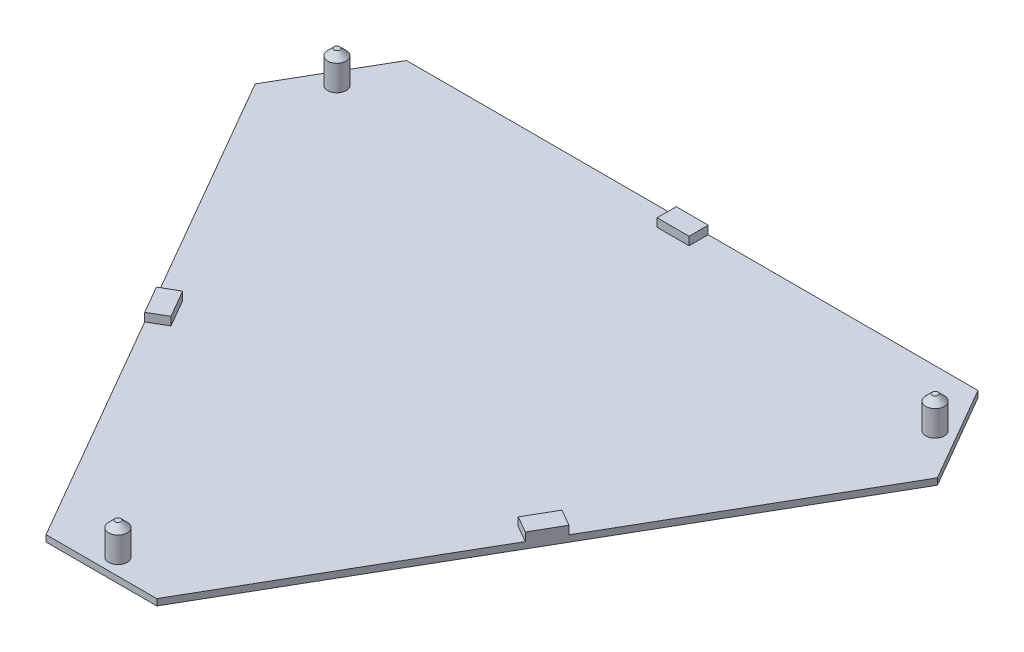
ISO-10303-21;
HEADER;
FILE_DESCRIPTION(('STEP AP214'),'2;1');
FILE_NAME('part.step','',(''),(''),'','','');
FILE_SCHEMA(('AUTOMOTIVE_DESIGN { 1 0 10303 214 1 1 1 1 }'));
ENDSEC;
DATA;
#1=APPLICATION_CONTEXT('core data for automotive mechanical design processes');
#2=APPLICATION_PROTOCOL_DEFINITION('international standard','automotive_design',2000,#1);
#3=PRODUCT_CONTEXT('',#1,'mechanical');
#4=PRODUCT('Part','Part','',(#3));
#5=PRODUCT_RELATED_PRODUCT_CATEGORY('part','',(#4));
#6=PRODUCT_DEFINITION_FORMATION('','',#4);
#7=PRODUCT_DEFINITION_CONTEXT('part definition',#1,'design');
#8=PRODUCT_DEFINITION('design','',#6,#7);
#9=PRODUCT_DEFINITION_SHAPE('','',#8);
#10=(LENGTH_UNIT() NAMED_UNIT(*) SI_UNIT(.MILLI.,.METRE.));
#11=(NAMED_UNIT(*) PLANE_ANGLE_UNIT() SI_UNIT($,.RADIAN.));
#12=(NAMED_UNIT(*) SI_UNIT($,.STERADIAN.) SOLID_ANGLE_UNIT());
#13=UNCERTAINTY_MEASURE_WITH_UNIT(LENGTH_MEASURE(1.E-05),#10,'distance_accuracy_value','');
#14=(GEOMETRIC_REPRESENTATION_CONTEXT(3) GLOBAL_UNCERTAINTY_ASSIGNED_CONTEXT((#13)) GLOBAL_UNIT_ASSIGNED_CONTEXT((#10,
#11,#12)) REPRESENTATION_CONTEXT('',''));
#15=CARTESIAN_POINT('',(0.,0.,0.));
#16=DIRECTION('',(0.,0.,1.));
#17=DIRECTION('',(1.,0.,0.));
#18=AXIS2_PLACEMENT_3D('',#15,#16,#17);
#19=CARTESIAN_POINT('',(0.,1.,0.));
#20=DIRECTION('',(0.,-1.,0.));
#21=DIRECTION('',(0.,0.,-1.));
#22=AXIS2_PLACEMENT_3D('',#19,#20,#21);
#23=PLANE('',#22);
#24=CARTESIAN_POINT('',(0.,1.,54.));
#25=DIRECTION('',(0.,-1.,0.));
#26=DIRECTION('',(0.,0.,-1.));
#27=AXIS2_PLACEMENT_3D('',#24,#25,#26);
#28=CIRCLE('',#27,1.45);
#29=CARTESIAN_POINT('',(0.,1.,52.55));
#30=VERTEX_POINT('',#29);
#31=EDGE_CURVE('E292',#30,#30,#28,.F.);
#32=ORIENTED_EDGE('',*,*,#31,.F.);
#33=EDGE_LOOP('',(#32));
#34=FACE_BOUND('',#33,.T.);
#35=CARTESIAN_POINT('',(-46.7653718043597,1.,-27.));
#36=DIRECTION('',(0.,-1.,0.));
#37=DIRECTION('',(0.,0.,-1.));
#38=AXIS2_PLACEMENT_3D('',#35,#36,#37);
#39=CIRCLE('',#38,1.45);
#40=CARTESIAN_POINT('',(-46.7653718043597,1.,-28.45));
#41=VERTEX_POINT('',#40);
#42=EDGE_CURVE('E295',#41,#41,#39,.F.);
#43=ORIENTED_EDGE('',*,*,#42,.F.);
#44=EDGE_LOOP('',(#43));
#45=FACE_BOUND('',#44,.T.);
#46=CARTESIAN_POINT('',(46.7653718043597,1.,-27.));
#47=DIRECTION('',(0.,-1.,0.));
#48=DIRECTION('',(0.,0.,-1.));
#49=AXIS2_PLACEMENT_3D('',#46,#47,#48);
#50=CIRCLE('',#49,1.45);
#51=CARTESIAN_POINT('',(46.7653718043597,1.,-28.45));
#52=VERTEX_POINT('',#51);
#53=EDGE_CURVE('E298',#52,#52,#50,.F.);
#54=ORIENTED_EDGE('',*,*,#53,.F.);
#55=EDGE_LOOP('',(#54));
#56=FACE_BOUND('',#55,.T.);
#57=DIRECTION('',(0.866025403784438,0.,-0.500000000000001));
#58=VECTOR('',#57,1.);
#59=CARTESIAN_POINT('',(1.24999999999999,1.,2.16506350946108));
#60=LINE('',#59,#58);
#61=CARTESIAN_POINT('',(-29.75,1.,20.0629218543395));
#62=VERTEX_POINT('',#61);
#63=CARTESIAN_POINT('',(-27.1519237886467,1.,18.5629218543395));
#64=VERTEX_POINT('',#63);
#65=EDGE_CURVE('E178',#62,#64,#60,.T.);
#66=ORIENTED_EDGE('',*,*,#65,.F.);
#67=DIRECTION('',(0.5,0.,0.866025403784438));
#68=VECTOR('',#67,1.);
#69=CARTESIAN_POINT('',(-53.3397459621556,1.,-20.7957166897568));
#70=LINE('',#69,#68);
#71=CARTESIAN_POINT('',(-8.6602540378444,1.,56.5914333795135));
#72=VERTEX_POINT('',#71);
#73=EDGE_CURVE('E253',#62,#72,#70,.T.);
#74=ORIENTED_EDGE('',*,*,#73,.T.);
#75=DIRECTION('',(1.,0.,0.));
#76=VECTOR('',#75,1.);
#77=CARTESIAN_POINT('',(8.66025403784441,1.,56.5914333795136));
#78=LINE('',#77,#76);
#79=CARTESIAN_POINT('',(8.66025403784441,1.,56.5914333795136));
#80=VERTEX_POINT('',#79);
#81=EDGE_CURVE('E256',#72,#80,#78,.T.);
#82=ORIENTED_EDGE('',*,*,#81,.T.);
#83=DIRECTION('',(0.5,0.,-0.866025403784439));
#84=VECTOR('',#83,1.);
#85=CARTESIAN_POINT('',(8.66025403784441,1.,56.5914333795136));
#86=LINE('',#85,#84);
#87=CARTESIAN_POINT('',(29.75,1.,20.0629218543395));
#88=VERTEX_POINT('',#87);
#89=EDGE_CURVE('E259',#80,#88,#86,.T.);
#90=ORIENTED_EDGE('',*,*,#89,.T.);
#91=DIRECTION('',(0.866025403784439,0.,0.5));
#92=VECTOR('',#91,1.);
#93=CARTESIAN_POINT('',(-1.25,1.,2.16506350946111));
#94=LINE('',#93,#92);
#95=CARTESIAN_POINT('',(27.1519237886467,1.,18.5629218543395));
#96=VERTEX_POINT('',#95);
#97=EDGE_CURVE('E208',#96,#88,#94,.T.);
#98=ORIENTED_EDGE('',*,*,#97,.F.);
#99=DIRECTION('',(-0.5,0.,0.866025403784438));
#100=VECTOR('',#99,1.);
#101=CARTESIAN_POINT('',(28.4019237886467,1.,16.3978583448784));
#102=LINE('',#101,#100);
#103=CARTESIAN_POINT('',(29.6519237886467,1.,14.2327948354173));
#104=VERTEX_POINT('',#103);
#105=EDGE_CURVE('E211',#104,#96,#102,.T.);
#106=ORIENTED_EDGE('',*,*,#105,.F.);
#107=DIRECTION('',(-0.866025403784439,0.,-0.499999999999999));
#108=VECTOR('',#107,1.);
#109=CARTESIAN_POINT('',(1.24999999999998,1.,-2.16506350946107));
#110=LINE('',#109,#108);
#111=CARTESIAN_POINT('',(32.25,1.,15.7327948354173));
#112=VERTEX_POINT('',#111);
#113=EDGE_CURVE('E214',#112,#104,#110,.T.);
#114=ORIENTED_EDGE('',*,*,#113,.F.);
#115=CARTESIAN_POINT('',(53.3397459621556,1.,-20.7957166897568));
#116=VERTEX_POINT('',#115);
#117=EDGE_CURVE('E258',#112,#116,#86,.T.);
#118=ORIENTED_EDGE('',*,*,#117,.T.);
#119=DIRECTION('',(-0.5,0.,-0.866025403784439));
#120=VECTOR('',#119,1.);
#121=CARTESIAN_POINT('',(44.6794919243112,1.,-35.7957166897568));
#122=LINE('',#121,#120);
#123=CARTESIAN_POINT('',(44.6794919243112,1.,-35.7957166897568));
#124=VERTEX_POINT('',#123);
#125=EDGE_CURVE('E261',#116,#124,#122,.T.);
#126=ORIENTED_EDGE('',*,*,#125,.T.);
#127=DIRECTION('',(-1.,0.,0.));
#128=VECTOR('',#127,1.);
#129=CARTESIAN_POINT('',(44.6794919243112,1.,-35.7957166897568));
#130=LINE('',#129,#128);
#131=CARTESIAN_POINT('',(2.5,1.,-35.7957166897568));
#132=VERTEX_POINT('',#131);
#133=EDGE_CURVE('E248',#124,#132,#130,.T.);
#134=ORIENTED_EDGE('',*,*,#133,.T.);
#135=DIRECTION('',(0.,0.,-1.));
#136=VECTOR('',#135,1.);
#137=CARTESIAN_POINT('',(2.50000000000001,1.,0.));
#138=LINE('',#137,#136);
#139=CARTESIAN_POINT('',(2.5,1.,-32.7957166897568));
#140=VERTEX_POINT('',#139);
#141=EDGE_CURVE('E238',#140,#132,#138,.T.);
#142=ORIENTED_EDGE('',*,*,#141,.F.);
#143=DIRECTION('',(1.,0.,0.));
#144=VECTOR('',#143,1.);
#145=CARTESIAN_POINT('',(0.,1.,-32.7957166897568));
#146=LINE('',#145,#144);
#147=CARTESIAN_POINT('',(-2.5,1.,-32.7957166897568));
#148=VERTEX_POINT('',#147);
#149=EDGE_CURVE('E241',#148,#140,#146,.T.);
#150=ORIENTED_EDGE('',*,*,#149,.F.);
#151=DIRECTION('',(0.,0.,1.));
#152=VECTOR('',#151,1.);
#153=CARTESIAN_POINT('',(-2.50000000000001,1.,0.));
#154=LINE('',#153,#152);
#155=CARTESIAN_POINT('',(-2.5,1.,-35.7957166897568));
#156=VERTEX_POINT('',#155);
#157=EDGE_CURVE('E244',#156,#148,#154,.T.);
#158=ORIENTED_EDGE('',*,*,#157,.F.);
#159=CARTESIAN_POINT('',(-44.6794919243112,1.,-35.7957166897568));
#160=VERTEX_POINT('',#159);
#161=EDGE_CURVE('E251',#156,#160,#130,.T.);
#162=ORIENTED_EDGE('',*,*,#161,.T.);
#163=DIRECTION('',(-0.499999999999999,0.,0.866025403784439));
#164=VECTOR('',#163,1.);
#165=CARTESIAN_POINT('',(-53.3397459621556,1.,-20.7957166897568));
#166=LINE('',#165,#164);
#167=CARTESIAN_POINT('',(-53.3397459621556,1.,-20.7957166897568));
#168=VERTEX_POINT('',#167);
#169=EDGE_CURVE('E250',#160,#168,#166,.T.);
#170=ORIENTED_EDGE('',*,*,#169,.T.);
#171=CARTESIAN_POINT('',(-32.25,1.,15.7327948354173));
#172=VERTEX_POINT('',#171);
#173=EDGE_CURVE('E254',#168,#172,#70,.T.);
#174=ORIENTED_EDGE('',*,*,#173,.T.);
#175=DIRECTION('',(-0.866025403784438,0.,0.5));
#176=VECTOR('',#175,1.);
#177=CARTESIAN_POINT('',(-1.25,1.,-2.1650635094611));
#178=LINE('',#177,#176);
#179=CARTESIAN_POINT('',(-29.6519237886467,1.,14.2327948354173));
#180=VERTEX_POINT('',#179);
#181=EDGE_CURVE('E53',#180,#172,#178,.T.);
#182=ORIENTED_EDGE('',*,*,#181,.F.);
#183=DIRECTION('',(-0.5,0.,-0.866025403784438));
#184=VECTOR('',#183,1.);
#185=CARTESIAN_POINT('',(-28.4019237886467,1.,16.3978583448784));
#186=LINE('',#185,#184);
#187=EDGE_CURVE('E48',#64,#180,#186,.T.);
#188=ORIENTED_EDGE('',*,*,#187,.F.);
#189=EDGE_LOOP('',(#66,#74,#82,#90,#98,#106,#114,#118,#126,#134,#142,#150,#158,#162,#170,#174,
#182,#188));
#190=FACE_BOUND('',#189,.T.);
#191=ADVANCED_FACE('F33',(#34,#45,#56,#190),#23,.F.);
#192=CARTESIAN_POINT('',(44.6794919243112,1.,-35.7957166897568));
#193=DIRECTION('',(0.,0.,1.));
#194=DIRECTION('',(1.,0.,0.));
#195=AXIS2_PLACEMENT_3D('',#192,#193,#194);
#196=PLANE('',#195);
#197=DIRECTION('',(-1.,0.,0.));
#198=VECTOR('',#197,1.);
#199=CARTESIAN_POINT('',(44.6794919243112,0.,-35.7957166897568));
#200=LINE('',#199,#198);
#201=CARTESIAN_POINT('',(44.6794919243112,0.,-35.7957166897568));
#202=VERTEX_POINT('',#201);
#203=CARTESIAN_POINT('',(-44.6794919243112,0.,-35.7957166897568));
#204=VERTEX_POINT('',#203);
#205=EDGE_CURVE('E247',#202,#204,#200,.T.);
#206=ORIENTED_EDGE('',*,*,#205,.T.);
#207=DIRECTION('',(0.,-1.,0.));
#208=VECTOR('',#207,1.);
#209=CARTESIAN_POINT('',(-44.6794919243112,1.,-35.7957166897568));
#210=LINE('',#209,#208);
#211=EDGE_CURVE('E289',#160,#204,#210,.T.);
#212=ORIENTED_EDGE('',*,*,#211,.F.);
#213=ORIENTED_EDGE('',*,*,#161,.F.);
#214=DIRECTION('',(0.,-1.,0.));
#215=VECTOR('',#214,1.);
#216=CARTESIAN_POINT('',(-2.5,2.3,-35.7957166897568));
#217=LINE('',#216,#215);
#218=CARTESIAN_POINT('',(-2.5,2.3,-35.7957166897568));
#219=VERTEX_POINT('',#218);
#220=EDGE_CURVE('E226',#219,#156,#217,.T.);
#221=ORIENTED_EDGE('',*,*,#220,.F.);
#222=DIRECTION('',(-1.,0.,0.));
#223=VECTOR('',#222,1.);
#224=CARTESIAN_POINT('',(-2.5,2.3,-35.7957166897568));
#225=LINE('',#224,#223);
#226=CARTESIAN_POINT('',(2.5,2.3,-35.7957166897568));
#227=VERTEX_POINT('',#226);
#228=EDGE_CURVE('E224',#227,#219,#225,.T.);
#229=ORIENTED_EDGE('',*,*,#228,.F.);
#230=DIRECTION('',(0.,-1.,0.));
#231=VECTOR('',#230,1.);
#232=CARTESIAN_POINT('',(2.5,2.3,-35.7957166897568));
#233=LINE('',#232,#231);
#234=EDGE_CURVE('E229',#227,#132,#233,.T.);
#235=ORIENTED_EDGE('',*,*,#234,.T.);
#236=ORIENTED_EDGE('',*,*,#133,.F.);
#237=DIRECTION('',(0.,-1.,0.));
#238=VECTOR('',#237,1.);
#239=CARTESIAN_POINT('',(44.6794919243112,1.,-35.7957166897568));
#240=LINE('',#239,#238);
#241=EDGE_CURVE('E263',#124,#202,#240,.T.);
#242=ORIENTED_EDGE('',*,*,#241,.T.);
#243=EDGE_LOOP('',(#206,#212,#213,#221,#229,#235,#236,#242));
#244=FACE_BOUND('',#243,.T.);
#245=ADVANCED_FACE('F332',(#244),#196,.F.);
#246=CARTESIAN_POINT('',(-53.3397459621556,1.,-20.7957166897568));
#247=DIRECTION('',(0.866025403784439,0.,0.499999999999999));
#248=DIRECTION('',(0.499999999999999,0.,-0.866025403784439));
#249=AXIS2_PLACEMENT_3D('',#246,#247,#248);
#250=PLANE('',#249);
#251=DIRECTION('',(-0.499999999999999,0.,0.866025403784439));
#252=VECTOR('',#251,1.);
#253=CARTESIAN_POINT('',(-53.3397459621556,0.,-20.7957166897568));
#254=LINE('',#253,#252);
#255=CARTESIAN_POINT('',(-53.3397459621556,0.,-20.7957166897568));
#256=VERTEX_POINT('',#255);
#257=EDGE_CURVE('E265',#204,#256,#254,.T.);
#258=ORIENTED_EDGE('',*,*,#257,.T.);
#259=DIRECTION('',(0.,-1.,0.));
#260=VECTOR('',#259,1.);
#261=CARTESIAN_POINT('',(-53.3397459621556,1.,-20.7957166897568));
#262=LINE('',#261,#260);
#263=EDGE_CURVE('E286',#168,#256,#262,.T.);
#264=ORIENTED_EDGE('',*,*,#263,.F.);
#265=ORIENTED_EDGE('',*,*,#169,.F.);
#266=ORIENTED_EDGE('',*,*,#211,.T.);
#267=EDGE_LOOP('',(#258,#264,#265,#266));
#268=FACE_BOUND('',#267,.T.);
#269=ADVANCED_FACE('F338',(#268),#250,.F.);
#270=CARTESIAN_POINT('',(-53.3397459621556,1.,-20.7957166897568));
#271=DIRECTION('',(0.866025403784439,0.,-0.5));
#272=DIRECTION('',(-0.5,0.,-0.866025403784438));
#273=AXIS2_PLACEMENT_3D('',#270,#271,#272);
#274=PLANE('',#273);
#275=DIRECTION('',(0.5,0.,0.866025403784438));
#276=VECTOR('',#275,1.);
#277=CARTESIAN_POINT('',(-53.3397459621556,0.,-20.7957166897568));
#278=LINE('',#277,#276);
#279=CARTESIAN_POINT('',(-8.6602540378444,0.,56.5914333795135));
#280=VERTEX_POINT('',#279);
#281=EDGE_CURVE('E267',#256,#280,#278,.T.);
#282=ORIENTED_EDGE('',*,*,#281,.T.);
#283=DIRECTION('',(0.,-1.,0.));
#284=VECTOR('',#283,1.);
#285=CARTESIAN_POINT('',(-8.6602540378444,1.,56.5914333795135));
#286=LINE('',#285,#284);
#287=EDGE_CURVE('E283',#72,#280,#286,.T.);
#288=ORIENTED_EDGE('',*,*,#287,.F.);
#289=ORIENTED_EDGE('',*,*,#73,.F.);
#290=DIRECTION('',(0.,-1.,0.));
#291=VECTOR('',#290,1.);
#292=CARTESIAN_POINT('',(-29.75,2.3,20.0629218543395));
#293=LINE('',#292,#291);
#294=CARTESIAN_POINT('',(-29.75,2.3,20.0629218543395));
#295=VERTEX_POINT('',#294);
#296=EDGE_CURVE('E614',#295,#62,#293,.T.);
#297=ORIENTED_EDGE('',*,*,#296,.F.);
#298=DIRECTION('',(0.500000000000001,0.,0.866025403784438));
#299=VECTOR('',#298,1.);
#300=CARTESIAN_POINT('',(-29.75,2.3,20.0629218543395));
#301=LINE('',#300,#299);
#302=CARTESIAN_POINT('',(-32.25,2.3,15.7327948354173));
#303=VERTEX_POINT('',#302);
#304=EDGE_CURVE('E172',#303,#295,#301,.T.);
#305=ORIENTED_EDGE('',*,*,#304,.F.);
#306=DIRECTION('',(0.,-1.,0.));
#307=VECTOR('',#306,1.);
#308=CARTESIAN_POINT('',(-32.25,2.3,15.7327948354173));
#309=LINE('',#308,#307);
#310=EDGE_CURVE('E181',#303,#172,#309,.T.);
#311=ORIENTED_EDGE('',*,*,#310,.T.);
#312=ORIENTED_EDGE('',*,*,#173,.F.);
#313=ORIENTED_EDGE('',*,*,#263,.T.);
#314=EDGE_LOOP('',(#282,#288,#289,#297,#305,#311,#312,#313));
#315=FACE_BOUND('',#314,.T.);
#316=ADVANCED_FACE('F362',(#315),#274,.F.);
#317=CARTESIAN_POINT('',(8.66025403784441,1.,56.5914333795136));
#318=DIRECTION('',(0.,0.,-1.));
#319=DIRECTION('',(-1.,0.,0.));
#320=AXIS2_PLACEMENT_3D('',#317,#318,#319);
#321=PLANE('',#320);
#322=DIRECTION('',(1.,0.,0.));
#323=VECTOR('',#322,1.);
#324=CARTESIAN_POINT('',(8.66025403784441,0.,56.5914333795136));
#325=LINE('',#324,#323);
#326=CARTESIAN_POINT('',(8.66025403784441,0.,56.5914333795136));
#327=VERTEX_POINT('',#326);
#328=EDGE_CURVE('E269',#280,#327,#325,.T.);
#329=ORIENTED_EDGE('',*,*,#328,.T.);
#330=DIRECTION('',(0.,-1.,0.));
#331=VECTOR('',#330,1.);
#332=CARTESIAN_POINT('',(8.66025403784441,1.,56.5914333795136));
#333=LINE('',#332,#331);
#334=EDGE_CURVE('E280',#80,#327,#333,.T.);
#335=ORIENTED_EDGE('',*,*,#334,.F.);
#336=ORIENTED_EDGE('',*,*,#81,.F.);
#337=ORIENTED_EDGE('',*,*,#287,.T.);
#338=EDGE_LOOP('',(#329,#335,#336,#337));
#339=FACE_BOUND('',#338,.T.);
#340=ADVANCED_FACE('F358',(#339),#321,.F.);
#341=CARTESIAN_POINT('',(8.66025403784441,1.,56.5914333795136));
#342=DIRECTION('',(-0.866025403784439,0.,-0.5));
#343=DIRECTION('',(-0.5,0.,0.866025403784439));
#344=AXIS2_PLACEMENT_3D('',#341,#342,#343);
#345=PLANE('',#344);
#346=DIRECTION('',(0.5,0.,-0.866025403784439));
#347=VECTOR('',#346,1.);
#348=CARTESIAN_POINT('',(8.66025403784441,0.,56.5914333795136));
#349=LINE('',#348,#347);
#350=CARTESIAN_POINT('',(53.3397459621556,0.,-20.7957166897568));
#351=VERTEX_POINT('',#350);
#352=EDGE_CURVE('E271',#327,#351,#349,.T.);
#353=ORIENTED_EDGE('',*,*,#352,.T.);
#354=DIRECTION('',(0.,-1.,0.));
#355=VECTOR('',#354,1.);
#356=CARTESIAN_POINT('',(53.3397459621556,1.,-20.7957166897568));
#357=LINE('',#356,#355);
#358=EDGE_CURVE('E277',#116,#351,#357,.T.);
#359=ORIENTED_EDGE('',*,*,#358,.F.);
#360=ORIENTED_EDGE('',*,*,#117,.F.);
#361=DIRECTION('',(0.,-1.,0.));
#362=VECTOR('',#361,1.);
#363=CARTESIAN_POINT('',(32.25,2.3,15.7327948354173));
#364=LINE('',#363,#362);
#365=CARTESIAN_POINT('',(32.25,2.3,15.7327948354173));
#366=VERTEX_POINT('',#365);
#367=EDGE_CURVE('E196',#366,#112,#364,.T.);
#368=ORIENTED_EDGE('',*,*,#367,.F.);
#369=DIRECTION('',(0.500000000000001,0.,-0.866025403784438));
#370=VECTOR('',#369,1.);
#371=CARTESIAN_POINT('',(32.25,2.3,15.7327948354173));
#372=LINE('',#371,#370);
#373=CARTESIAN_POINT('',(29.75,2.3,20.0629218543395));
#374=VERTEX_POINT('',#373);
#375=EDGE_CURVE('E194',#374,#366,#372,.T.);
#376=ORIENTED_EDGE('',*,*,#375,.F.);
#377=DIRECTION('',(0.,-1.,0.));
#378=VECTOR('',#377,1.);
#379=CARTESIAN_POINT('',(29.75,2.3,20.0629218543395));
#380=LINE('',#379,#378);
#381=EDGE_CURVE('E199',#374,#88,#380,.T.);
#382=ORIENTED_EDGE('',*,*,#381,.T.);
#383=ORIENTED_EDGE('',*,*,#89,.F.);
#384=ORIENTED_EDGE('',*,*,#334,.T.);
#385=EDGE_LOOP('',(#353,#359,#360,#368,#376,#382,#383,#384));
#386=FACE_BOUND('',#385,.T.);
#387=ADVANCED_FACE('F354',(#386),#345,.F.);
#388=CARTESIAN_POINT('',(44.6794919243112,1.,-35.7957166897568));
#389=DIRECTION('',(-0.866025403784439,0.,0.5));
#390=DIRECTION('',(0.5,0.,0.866025403784439));
#391=AXIS2_PLACEMENT_3D('',#388,#389,#390);
#392=PLANE('',#391);
#393=DIRECTION('',(-0.5,0.,-0.866025403784439));
#394=VECTOR('',#393,1.);
#395=CARTESIAN_POINT('',(44.6794919243112,0.,-35.7957166897568));
#396=LINE('',#395,#394);
#397=EDGE_CURVE('E273',#351,#202,#396,.T.);
#398=ORIENTED_EDGE('',*,*,#397,.T.);
#399=ORIENTED_EDGE('',*,*,#241,.F.);
#400=ORIENTED_EDGE('',*,*,#125,.F.);
#401=ORIENTED_EDGE('',*,*,#358,.T.);
#402=EDGE_LOOP('',(#398,#399,#400,#401));
#403=FACE_BOUND('',#402,.T.);
#404=ADVANCED_FACE('F350',(#403),#392,.F.);
#405=CARTESIAN_POINT('',(0.,0.,0.));
#406=DIRECTION('',(0.,-1.,0.));
#407=DIRECTION('',(0.,0.,-1.));
#408=AXIS2_PLACEMENT_3D('',#405,#406,#407);
#409=PLANE('',#408);
#410=ORIENTED_EDGE('',*,*,#328,.F.);
#411=ORIENTED_EDGE('',*,*,#281,.F.);
#412=ORIENTED_EDGE('',*,*,#257,.F.);
#413=ORIENTED_EDGE('',*,*,#205,.F.);
#414=ORIENTED_EDGE('',*,*,#397,.F.);
#415=ORIENTED_EDGE('',*,*,#352,.F.);
#416=EDGE_LOOP('',(#410,#411,#412,#413,#414,#415));
#417=FACE_BOUND('',#416,.T.);
#418=ADVANCED_FACE('F347',(#417),#409,.T.);
#419=CARTESIAN_POINT('',(0.,6.,54.));
#420=DIRECTION('',(0.,-1.,0.));
#421=DIRECTION('',(0.,0.,-1.));
#422=AXIS2_PLACEMENT_3D('',#419,#420,#421);
#423=CYLINDRICAL_SURFACE('',#422,1.45);
#424=CARTESIAN_POINT('',(0.,4.99999999999999,54.));
#425=DIRECTION('',(0.,1.,0.));
#426=DIRECTION('',(0.,0.,1.));
#427=AXIS2_PLACEMENT_3D('',#424,#425,#426);
#428=CIRCLE('',#427,1.45);
#429=CARTESIAN_POINT('',(0.,4.99999999999999,52.55));
#430=VERTEX_POINT('',#429);
#431=EDGE_CURVE('E11',#430,#430,#428,.F.);
#432=ORIENTED_EDGE('',*,*,#431,.T.);
#433=EDGE_LOOP('',(#432));
#434=FACE_BOUND('',#433,.T.);
#435=ORIENTED_EDGE('',*,*,#31,.T.);
#436=EDGE_LOOP('',(#435));
#437=FACE_BOUND('',#436,.T.);
#438=ADVANCED_FACE('F345',(#434,#437),#423,.T.);
#439=CARTESIAN_POINT('',(0.,6.,54.));
#440=DIRECTION('',(0.,1.,0.));
#441=DIRECTION('',(0.,0.,1.));
#442=AXIS2_PLACEMENT_3D('',#439,#440,#441);
#443=PLANE('',#442);
#444=CARTESIAN_POINT('',(0.,6.,54.));
#445=DIRECTION('',(0.,1.,0.));
#446=DIRECTION('',(0.,0.,1.));
#447=AXIS2_PLACEMENT_3D('',#444,#445,#446);
#448=CIRCLE('',#447,0.450000000000006);
#449=CARTESIAN_POINT('',(0.,6.,53.55));
#450=VERTEX_POINT('',#449);
#451=EDGE_CURVE('E41',#450,#450,#448,.T.);
#452=ORIENTED_EDGE('',*,*,#451,.T.);
#453=EDGE_LOOP('',(#452));
#454=FACE_BOUND('',#453,.T.);
#455=ADVANCED_FACE('F315',(#454),#443,.T.);
#456=CARTESIAN_POINT('',(-46.7653718043597,6.,-27.));
#457=DIRECTION('',(0.,-1.,0.));
#458=DIRECTION('',(0.,0.,-1.));
#459=AXIS2_PLACEMENT_3D('',#456,#457,#458);
#460=CYLINDRICAL_SURFACE('',#459,1.45);
#461=CARTESIAN_POINT('',(-46.7653718043597,5.,-27.));
#462=DIRECTION('',(0.,1.,0.));
#463=DIRECTION('',(0.,0.,1.));
#464=AXIS2_PLACEMENT_3D('',#461,#462,#463);
#465=CIRCLE('',#464,1.45);
#466=CARTESIAN_POINT('',(-46.7653718043597,5.,-28.45));
#467=VERTEX_POINT('',#466);
#468=EDGE_CURVE('E304',#467,#467,#465,.F.);
#469=ORIENTED_EDGE('',*,*,#468,.T.);
#470=EDGE_LOOP('',(#469));
#471=FACE_BOUND('',#470,.T.);
#472=ORIENTED_EDGE('',*,*,#42,.T.);
#473=EDGE_LOOP('',(#472));
#474=FACE_BOUND('',#473,.T.);
#475=ADVANCED_FACE('F385',(#471,#474),#460,.T.);
#476=CARTESIAN_POINT('',(-46.7653718043597,6.,-27.));
#477=DIRECTION('',(0.,1.,0.));
#478=DIRECTION('',(0.,0.,1.));
#479=AXIS2_PLACEMENT_3D('',#476,#477,#478);
#480=PLANE('',#479);
#481=CARTESIAN_POINT('',(-46.7653718043597,6.,-27.));
#482=DIRECTION('',(0.,1.,0.));
#483=DIRECTION('',(0.,0.,1.));
#484=AXIS2_PLACEMENT_3D('',#481,#482,#483);
#485=CIRCLE('',#484,0.450000000000006);
#486=CARTESIAN_POINT('',(-46.7653718043597,6.,-27.45));
#487=VERTEX_POINT('',#486);
#488=EDGE_CURVE('E301',#487,#487,#485,.T.);
#489=ORIENTED_EDGE('',*,*,#488,.T.);
#490=EDGE_LOOP('',(#489));
#491=FACE_BOUND('',#490,.T.);
#492=ADVANCED_FACE('F383',(#491),#480,.T.);
#493=CARTESIAN_POINT('',(46.7653718043597,6.,-27.));
#494=DIRECTION('',(0.,-1.,0.));
#495=DIRECTION('',(0.,0.,-1.));
#496=AXIS2_PLACEMENT_3D('',#493,#494,#495);
#497=CYLINDRICAL_SURFACE('',#496,1.45);
#498=CARTESIAN_POINT('',(46.7653718043597,5.,-27.));
#499=DIRECTION('',(0.,1.,0.));
#500=DIRECTION('',(0.,0.,1.));
#501=AXIS2_PLACEMENT_3D('',#498,#499,#500);
#502=CIRCLE('',#501,1.45);
#503=CARTESIAN_POINT('',(46.7653718043597,5.,-28.45));
#504=VERTEX_POINT('',#503);
#505=EDGE_CURVE('E310',#504,#504,#502,.F.);
#506=ORIENTED_EDGE('',*,*,#505,.T.);
#507=EDGE_LOOP('',(#506));
#508=FACE_BOUND('',#507,.T.);
#509=ORIENTED_EDGE('',*,*,#53,.T.);
#510=EDGE_LOOP('',(#509));
#511=FACE_BOUND('',#510,.T.);
#512=ADVANCED_FACE('F376',(#508,#511),#497,.T.);
#513=CARTESIAN_POINT('',(46.7653718043597,6.,-27.));
#514=DIRECTION('',(0.,1.,0.));
#515=DIRECTION('',(0.,0.,1.));
#516=AXIS2_PLACEMENT_3D('',#513,#514,#515);
#517=PLANE('',#516);
#518=CARTESIAN_POINT('',(46.7653718043597,6.,-27.));
#519=DIRECTION('',(0.,1.,0.));
#520=DIRECTION('',(0.,0.,1.));
#521=AXIS2_PLACEMENT_3D('',#518,#519,#520);
#522=CIRCLE('',#521,0.450000000000006);
#523=CARTESIAN_POINT('',(46.7653718043597,6.,-27.45));
#524=VERTEX_POINT('',#523);
#525=EDGE_CURVE('E307',#524,#524,#522,.T.);
#526=ORIENTED_EDGE('',*,*,#525,.T.);
#527=EDGE_LOOP('',(#526));
#528=FACE_BOUND('',#527,.T.);
#529=ADVANCED_FACE('F371',(#528),#517,.T.);
#530=CARTESIAN_POINT('',(-46.7653718043597,6.,-27.));
#531=DIRECTION('',(0.,-1.,0.));
#532=DIRECTION('',(0.,0.,-1.));
#533=AXIS2_PLACEMENT_3D('',#530,#531,#532);
#534=CONICAL_SURFACE('',#533,0.450000000000006,0.785398163397446);
#535=CARTESIAN_POINT('',(-46.7653718043597,5.,-28.45));
#536=CARTESIAN_POINT('',(-46.7653718043597,5.01041666666667,-28.4395833333333));
#537=CARTESIAN_POINT('',(-46.7653718043597,5.02083333333333,-28.4291666666667));
#538=CARTESIAN_POINT('',(-46.7653718043597,5.04166666666667,-28.4083333333333));
#539=CARTESIAN_POINT('',(-46.7653718043597,5.05208333333333,-28.3979166666667));
#540=CARTESIAN_POINT('',(-46.7653718043597,5.07291666666667,-28.3770833333333));
#541=CARTESIAN_POINT('',(-46.7653718043597,5.08333333333333,-28.3666666666667));
#542=CARTESIAN_POINT('',(-46.7653718043597,5.10416666666667,-28.3458333333333));
#543=CARTESIAN_POINT('',(-46.7653718043597,5.11458333333333,-28.3354166666667));
#544=CARTESIAN_POINT('',(-46.7653718043597,5.13541666666667,-28.3145833333333));
#545=CARTESIAN_POINT('',(-46.7653718043597,5.14583333333333,-28.3041666666667));
#546=CARTESIAN_POINT('',(-46.7653718043597,5.16666666666667,-28.2833333333333));
#547=CARTESIAN_POINT('',(-46.7653718043597,5.17708333333333,-28.2729166666667));
#548=CARTESIAN_POINT('',(-46.7653718043597,5.19791666666667,-28.2520833333333));
#549=CARTESIAN_POINT('',(-46.7653718043597,5.20833333333333,-28.2416666666667));
#550=CARTESIAN_POINT('',(-46.7653718043597,5.22916666666667,-28.2208333333333));
#551=CARTESIAN_POINT('',(-46.7653718043597,5.23958333333333,-28.2104166666667));
#552=CARTESIAN_POINT('',(-46.7653718043597,5.26041666666667,-28.1895833333333));
#553=CARTESIAN_POINT('',(-46.7653718043597,5.27083333333333,-28.1791666666667));
#554=CARTESIAN_POINT('',(-46.7653718043597,5.29166666666667,-28.1583333333333));
#555=CARTESIAN_POINT('',(-46.7653718043597,5.30208333333333,-28.1479166666667));
#556=CARTESIAN_POINT('',(-46.7653718043597,5.32291666666667,-28.1270833333333));
#557=CARTESIAN_POINT('',(-46.7653718043597,5.33333333333333,-28.1166666666667));
#558=CARTESIAN_POINT('',(-46.7653718043597,5.35416666666667,-28.0958333333333));
#559=CARTESIAN_POINT('',(-46.7653718043597,5.36458333333333,-28.0854166666667));
#560=CARTESIAN_POINT('',(-46.7653718043597,5.38541666666667,-28.0645833333333));
#561=CARTESIAN_POINT('',(-46.7653718043597,5.39583333333333,-28.0541666666667));
#562=CARTESIAN_POINT('',(-46.7653718043597,5.41666666666667,-28.0333333333333));
#563=CARTESIAN_POINT('',(-46.7653718043597,5.42708333333333,-28.0229166666667));
#564=CARTESIAN_POINT('',(-46.7653718043597,5.44791666666667,-28.0020833333333));
#565=CARTESIAN_POINT('',(-46.7653718043597,5.45833333333333,-27.9916666666667));
#566=CARTESIAN_POINT('',(-46.7653718043597,5.47916666666667,-27.9708333333333));
#567=CARTESIAN_POINT('',(-46.7653718043597,5.48958333333333,-27.9604166666667));
#568=CARTESIAN_POINT('',(-46.7653718043597,5.51041666666667,-27.9395833333333));
#569=CARTESIAN_POINT('',(-46.7653718043597,5.52083333333333,-27.9291666666667));
#570=CARTESIAN_POINT('',(-46.7653718043597,5.54166666666667,-27.9083333333333));
#571=CARTESIAN_POINT('',(-46.7653718043597,5.55208333333333,-27.8979166666667));
#572=CARTESIAN_POINT('',(-46.7653718043597,5.57291666666667,-27.8770833333333));
#573=CARTESIAN_POINT('',(-46.7653718043597,5.58333333333333,-27.8666666666667));
#574=CARTESIAN_POINT('',(-46.7653718043597,5.60416666666667,-27.8458333333333));
#575=CARTESIAN_POINT('',(-46.7653718043597,5.61458333333333,-27.8354166666667));
#576=CARTESIAN_POINT('',(-46.7653718043597,5.63541666666667,-27.8145833333333));
#577=CARTESIAN_POINT('',(-46.7653718043597,5.64583333333333,-27.8041666666667));
#578=CARTESIAN_POINT('',(-46.7653718043597,5.66666666666667,-27.7833333333333));
#579=CARTESIAN_POINT('',(-46.7653718043597,5.67708333333333,-27.7729166666667));
#580=CARTESIAN_POINT('',(-46.7653718043597,5.69791666666667,-27.7520833333333));
#581=CARTESIAN_POINT('',(-46.7653718043597,5.70833333333333,-27.7416666666667));
#582=CARTESIAN_POINT('',(-46.7653718043597,5.72916666666667,-27.7208333333333));
#583=CARTESIAN_POINT('',(-46.7653718043597,5.73958333333333,-27.7104166666667));
#584=CARTESIAN_POINT('',(-46.7653718043597,5.76041666666667,-27.6895833333333));
#585=CARTESIAN_POINT('',(-46.7653718043597,5.77083333333333,-27.6791666666667));
#586=CARTESIAN_POINT('',(-46.7653718043597,5.79166666666667,-27.6583333333333));
#587=CARTESIAN_POINT('',(-46.7653718043597,5.80208333333333,-27.6479166666667));
#588=CARTESIAN_POINT('',(-46.7653718043597,5.82291666666667,-27.6270833333333));
#589=CARTESIAN_POINT('',(-46.7653718043597,5.83333333333333,-27.6166666666667));
#590=CARTESIAN_POINT('',(-46.7653718043597,5.85416666666667,-27.5958333333333));
#591=CARTESIAN_POINT('',(-46.7653718043597,5.86458333333333,-27.5854166666667));
#592=CARTESIAN_POINT('',(-46.7653718043597,5.88541666666667,-27.5645833333333));
#593=CARTESIAN_POINT('',(-46.7653718043597,5.89583333333333,-27.5541666666667));
#594=CARTESIAN_POINT('',(-46.7653718043597,5.91666666666667,-27.5333333333333));
#595=CARTESIAN_POINT('',(-46.7653718043597,5.92708333333333,-27.5229166666667));
#596=CARTESIAN_POINT('',(-46.7653718043597,5.94791666666667,-27.5020833333333));
#597=CARTESIAN_POINT('',(-46.7653718043597,5.95833333333333,-27.4916666666667));
#598=CARTESIAN_POINT('',(-46.7653718043597,5.97916666666667,-27.4708333333333));
#599=CARTESIAN_POINT('',(-46.7653718043597,5.98958333333333,-27.4604166666667));
#600=CARTESIAN_POINT('',(-46.7653718043597,6.,-27.45));
#601=B_SPLINE_CURVE_WITH_KNOTS('',3,(#535,#536,#537,#538,#539,#540,#541,#542,#543,#544,#545,
#546,#547,#548,#549,#550,#551,#552,#553,#554,#555,#556,#557,#558,#559,#560,#561,#562,#563,#564,
#565,#566,#567,#568,#569,#570,#571,#572,#573,#574,#575,#576,#577,#578,#579,#580,#581,#582,#583,
#584,#585,#586,#587,#588,#589,#590,#591,#592,#593,#594,#595,#596,#597,#598,#599,#600),
.UNSPECIFIED.,.F.,.F.,(4,2,2,2,2,2,2,2,2,2,2,2,2,2,2,2,2,2,2,2,2,2,2,2,2,2,2,2,2,2,2,2,4),(0.,
0.0441941738241593,0.0883883476483179,0.132582521472477,0.176776695296636,0.220970869120796,
0.265165042944952,0.309359216769112,0.353553390593271,0.39774756441743,0.44194173824159,
0.486135912065749,0.530330085889908,0.574524259714067,0.618718433538227,0.662912607362385,
0.707106781186545,0.751300955010704,0.795495128834863,0.839689302659022,0.883883476483182,
0.928077650307341,0.9722718241315,1.01646599795566,1.06066017177982,1.10485434560398,
1.14904851942814,1.19324269325229,1.23743686707645,1.28163104090061,1.32582521472477,
1.37001938854893,1.41421356237309),.UNSPECIFIED.);
#602=EDGE_CURVE('BSEAM328',#467,#487,#601,.T.);
#603=ORIENTED_EDGE('',*,*,#468,.F.);
#604=ORIENTED_EDGE('',*,*,#488,.F.);
#605=ORIENTED_EDGE('',*,*,#602,.T.);
#606=ORIENTED_EDGE('',*,*,#602,.F.);
#607=EDGE_LOOP('',(#603,#605,#604,#606));
#608=FACE_BOUND('',#607,.T.);
#609=ADVANCED_FACE('F328',(#608),#534,.T.);
#610=CARTESIAN_POINT('',(46.7653718043597,6.,-27.));
#611=DIRECTION('',(0.,-1.,0.));
#612=DIRECTION('',(0.,0.,-1.));
#613=AXIS2_PLACEMENT_3D('',#610,#611,#612);
#614=CONICAL_SURFACE('',#613,0.450000000000006,0.785398163397446);
#615=CARTESIAN_POINT('',(46.7653718043597,5.,-28.45));
#616=CARTESIAN_POINT('',(46.7653718043597,5.01041666666667,-28.4395833333334));
#617=CARTESIAN_POINT('',(46.7653718043597,5.02083333333333,-28.4291666666667));
#618=CARTESIAN_POINT('',(46.7653718043597,5.04166666666667,-28.4083333333334));
#619=CARTESIAN_POINT('',(46.7653718043597,5.05208333333333,-28.3979166666667));
#620=CARTESIAN_POINT('',(46.7653718043597,5.07291666666667,-28.3770833333334));
#621=CARTESIAN_POINT('',(46.7653718043597,5.08333333333333,-28.3666666666667));
#622=CARTESIAN_POINT('',(46.7653718043597,5.10416666666667,-28.3458333333334));
#623=CARTESIAN_POINT('',(46.7653718043597,5.11458333333333,-28.3354166666667));
#624=CARTESIAN_POINT('',(46.7653718043597,5.13541666666667,-28.3145833333334));
#625=CARTESIAN_POINT('',(46.7653718043597,5.14583333333333,-28.3041666666667));
#626=CARTESIAN_POINT('',(46.7653718043597,5.16666666666667,-28.2833333333334));
#627=CARTESIAN_POINT('',(46.7653718043597,5.17708333333333,-28.2729166666667));
#628=CARTESIAN_POINT('',(46.7653718043597,5.19791666666667,-28.2520833333334));
#629=CARTESIAN_POINT('',(46.7653718043597,5.20833333333333,-28.2416666666667));
#630=CARTESIAN_POINT('',(46.7653718043597,5.22916666666667,-28.2208333333334));
#631=CARTESIAN_POINT('',(46.7653718043597,5.23958333333333,-28.2104166666667));
#632=CARTESIAN_POINT('',(46.7653718043597,5.26041666666667,-28.1895833333334));
#633=CARTESIAN_POINT('',(46.7653718043597,5.27083333333333,-28.1791666666667));
#634=CARTESIAN_POINT('',(46.7653718043597,5.29166666666667,-28.1583333333334));
#635=CARTESIAN_POINT('',(46.7653718043597,5.30208333333333,-28.1479166666667));
#636=CARTESIAN_POINT('',(46.7653718043597,5.32291666666667,-28.1270833333334));
#637=CARTESIAN_POINT('',(46.7653718043597,5.33333333333333,-28.1166666666667));
#638=CARTESIAN_POINT('',(46.7653718043597,5.35416666666667,-28.0958333333334));
#639=CARTESIAN_POINT('',(46.7653718043597,5.36458333333333,-28.0854166666667));
#640=CARTESIAN_POINT('',(46.7653718043597,5.38541666666667,-28.0645833333334));
#641=CARTESIAN_POINT('',(46.7653718043597,5.39583333333333,-28.0541666666667));
#642=CARTESIAN_POINT('',(46.7653718043597,5.41666666666667,-28.0333333333334));
#643=CARTESIAN_POINT('',(46.7653718043597,5.42708333333333,-28.0229166666667));
#644=CARTESIAN_POINT('',(46.7653718043597,5.44791666666667,-28.0020833333334));
#645=CARTESIAN_POINT('',(46.7653718043597,5.45833333333333,-27.9916666666667));
#646=CARTESIAN_POINT('',(46.7653718043597,5.47916666666667,-27.9708333333334));
#647=CARTESIAN_POINT('',(46.7653718043597,5.48958333333333,-27.9604166666667));
#648=CARTESIAN_POINT('',(46.7653718043597,5.51041666666667,-27.9395833333334));
#649=CARTESIAN_POINT('',(46.7653718043597,5.52083333333333,-27.9291666666667));
#650=CARTESIAN_POINT('',(46.7653718043597,5.54166666666667,-27.9083333333334));
#651=CARTESIAN_POINT('',(46.7653718043597,5.55208333333333,-27.8979166666667));
#652=CARTESIAN_POINT('',(46.7653718043597,5.57291666666667,-27.8770833333334));
#653=CARTESIAN_POINT('',(46.7653718043597,5.58333333333333,-27.8666666666667));
#654=CARTESIAN_POINT('',(46.7653718043597,5.60416666666667,-27.8458333333334));
#655=CARTESIAN_POINT('',(46.7653718043597,5.61458333333333,-27.8354166666667));
#656=CARTESIAN_POINT('',(46.7653718043597,5.63541666666667,-27.8145833333334));
#657=CARTESIAN_POINT('',(46.7653718043597,5.64583333333333,-27.8041666666667));
#658=CARTESIAN_POINT('',(46.7653718043597,5.66666666666667,-27.7833333333334));
#659=CARTESIAN_POINT('',(46.7653718043597,5.67708333333333,-27.7729166666667));
#660=CARTESIAN_POINT('',(46.7653718043597,5.69791666666667,-27.7520833333334));
#661=CARTESIAN_POINT('',(46.7653718043597,5.70833333333333,-27.7416666666667));
#662=CARTESIAN_POINT('',(46.7653718043597,5.72916666666667,-27.7208333333334));
#663=CARTESIAN_POINT('',(46.7653718043597,5.73958333333333,-27.7104166666667));
#664=CARTESIAN_POINT('',(46.7653718043597,5.76041666666667,-27.6895833333334));
#665=CARTESIAN_POINT('',(46.7653718043597,5.77083333333333,-27.6791666666667));
#666=CARTESIAN_POINT('',(46.7653718043597,5.79166666666667,-27.6583333333334));
#667=CARTESIAN_POINT('',(46.7653718043597,5.80208333333333,-27.6479166666667));
#668=CARTESIAN_POINT('',(46.7653718043597,5.82291666666667,-27.6270833333334));
#669=CARTESIAN_POINT('',(46.7653718043597,5.83333333333333,-27.6166666666667));
#670=CARTESIAN_POINT('',(46.7653718043597,5.85416666666667,-27.5958333333334));
#671=CARTESIAN_POINT('',(46.7653718043597,5.86458333333333,-27.5854166666667));
#672=CARTESIAN_POINT('',(46.7653718043597,5.88541666666667,-27.5645833333334));
#673=CARTESIAN_POINT('',(46.7653718043597,5.89583333333333,-27.5541666666667));
#674=CARTESIAN_POINT('',(46.7653718043597,5.91666666666667,-27.5333333333334));
#675=CARTESIAN_POINT('',(46.7653718043597,5.92708333333333,-27.5229166666667));
#676=CARTESIAN_POINT('',(46.7653718043597,5.94791666666667,-27.5020833333334));
#677=CARTESIAN_POINT('',(46.7653718043597,5.95833333333333,-27.4916666666667));
#678=CARTESIAN_POINT('',(46.7653718043597,5.97916666666667,-27.4708333333334));
#679=CARTESIAN_POINT('',(46.7653718043597,5.98958333333333,-27.4604166666667));
#680=CARTESIAN_POINT('',(46.7653718043597,6.,-27.45));
#681=B_SPLINE_CURVE_WITH_KNOTS('',3,(#615,#616,#617,#618,#619,#620,#621,#622,#623,#624,#625,
#626,#627,#628,#629,#630,#631,#632,#633,#634,#635,#636,#637,#638,#639,#640,#641,#642,#643,#644,
#645,#646,#647,#648,#649,#650,#651,#652,#653,#654,#655,#656,#657,#658,#659,#660,#661,#662,#663,
#664,#665,#666,#667,#668,#669,#670,#671,#672,#673,#674,#675,#676,#677,#678,#679,#680),
.UNSPECIFIED.,.F.,.F.,(4,2,2,2,2,2,2,2,2,2,2,2,2,2,2,2,2,2,2,2,2,2,2,2,2,2,2,2,2,2,2,2,4),(0.,
0.0441941738241593,0.0883883476483179,0.132582521472477,0.176776695296636,0.220970869120796,
0.265165042944952,0.309359216769112,0.353553390593271,0.39774756441743,0.44194173824159,
0.486135912065749,0.530330085889908,0.574524259714067,0.618718433538227,0.662912607362385,
0.707106781186545,0.751300955010704,0.795495128834863,0.839689302659022,0.883883476483182,
0.928077650307341,0.9722718241315,1.01646599795566,1.06066017177982,1.10485434560398,
1.14904851942814,1.19324269325229,1.23743686707645,1.28163104090061,1.32582521472477,
1.37001938854893,1.41421356237309),.UNSPECIFIED.);
#682=EDGE_CURVE('BSEAM319',#504,#524,#681,.T.);
#683=ORIENTED_EDGE('',*,*,#505,.F.);
#684=ORIENTED_EDGE('',*,*,#525,.F.);
#685=ORIENTED_EDGE('',*,*,#682,.T.);
#686=ORIENTED_EDGE('',*,*,#682,.F.);
#687=EDGE_LOOP('',(#683,#685,#684,#686));
#688=FACE_BOUND('',#687,.T.);
#689=ADVANCED_FACE('F319',(#688),#614,.T.);
#690=CARTESIAN_POINT('',(0.,6.,54.));
#691=DIRECTION('',(0.,-1.,0.));
#692=DIRECTION('',(0.,0.,-1.));
#693=AXIS2_PLACEMENT_3D('',#690,#691,#692);
#694=CONICAL_SURFACE('',#693,0.450000000000006,0.785398163397441);
#695=CARTESIAN_POINT('',(0.,4.99999999999999,52.55));
#696=CARTESIAN_POINT('',(0.,5.01041666666666,52.5604166666667));
#697=CARTESIAN_POINT('',(0.,5.02083333333333,52.5708333333333));
#698=CARTESIAN_POINT('',(0.,5.04166666666666,52.5916666666667));
#699=CARTESIAN_POINT('',(0.,5.05208333333332,52.6020833333333));
#700=CARTESIAN_POINT('',(0.,5.07291666666666,52.6229166666667));
#701=CARTESIAN_POINT('',(0.,5.08333333333333,52.6333333333333));
#702=CARTESIAN_POINT('',(0.,5.10416666666666,52.6541666666667));
#703=CARTESIAN_POINT('',(0.,5.11458333333333,52.6645833333333));
#704=CARTESIAN_POINT('',(0.,5.13541666666666,52.6854166666667));
#705=CARTESIAN_POINT('',(0.,5.14583333333333,52.6958333333333));
#706=CARTESIAN_POINT('',(0.,5.16666666666666,52.7166666666667));
#707=CARTESIAN_POINT('',(0.,5.17708333333333,52.7270833333333));
#708=CARTESIAN_POINT('',(0.,5.19791666666666,52.7479166666667));
#709=CARTESIAN_POINT('',(0.,5.20833333333333,52.7583333333333));
#710=CARTESIAN_POINT('',(0.,5.22916666666666,52.7791666666667));
#711=CARTESIAN_POINT('',(0.,5.23958333333333,52.7895833333333));
#712=CARTESIAN_POINT('',(0.,5.26041666666666,52.8104166666667));
#713=CARTESIAN_POINT('',(0.,5.27083333333333,52.8208333333333));
#714=CARTESIAN_POINT('',(0.,5.29166666666666,52.8416666666667));
#715=CARTESIAN_POINT('',(0.,5.30208333333333,52.8520833333333));
#716=CARTESIAN_POINT('',(0.,5.32291666666666,52.8729166666667));
#717=CARTESIAN_POINT('',(0.,5.33333333333333,52.8833333333333));
#718=CARTESIAN_POINT('',(0.,5.35416666666666,52.9041666666667));
#719=CARTESIAN_POINT('',(0.,5.36458333333333,52.9145833333333));
#720=CARTESIAN_POINT('',(0.,5.38541666666666,52.9354166666667));
#721=CARTESIAN_POINT('',(0.,5.39583333333333,52.9458333333333));
#722=CARTESIAN_POINT('',(0.,5.41666666666666,52.9666666666667));
#723=CARTESIAN_POINT('',(0.,5.42708333333333,52.9770833333333));
#724=CARTESIAN_POINT('',(0.,5.44791666666666,52.9979166666667));
#725=CARTESIAN_POINT('',(0.,5.45833333333333,53.0083333333333));
#726=CARTESIAN_POINT('',(0.,5.47916666666666,53.0291666666667));
#727=CARTESIAN_POINT('',(0.,5.48958333333333,53.0395833333333));
#728=CARTESIAN_POINT('',(0.,5.51041666666666,53.0604166666667));
#729=CARTESIAN_POINT('',(0.,5.52083333333333,53.0708333333333));
#730=CARTESIAN_POINT('',(0.,5.54166666666666,53.0916666666667));
#731=CARTESIAN_POINT('',(0.,5.55208333333333,53.1020833333333));
#732=CARTESIAN_POINT('',(0.,5.57291666666666,53.1229166666667));
#733=CARTESIAN_POINT('',(0.,5.58333333333333,53.1333333333333));
#734=CARTESIAN_POINT('',(0.,5.60416666666666,53.1541666666667));
#735=CARTESIAN_POINT('',(0.,5.61458333333333,53.1645833333333));
#736=CARTESIAN_POINT('',(0.,5.63541666666666,53.1854166666667));
#737=CARTESIAN_POINT('',(0.,5.64583333333333,53.1958333333333));
#738=CARTESIAN_POINT('',(0.,5.66666666666666,53.2166666666667));
#739=CARTESIAN_POINT('',(0.,5.67708333333333,53.2270833333333));
#740=CARTESIAN_POINT('',(0.,5.69791666666666,53.2479166666667));
#741=CARTESIAN_POINT('',(0.,5.70833333333333,53.2583333333333));
#742=CARTESIAN_POINT('',(0.,5.72916666666666,53.2791666666667));
#743=CARTESIAN_POINT('',(0.,5.73958333333333,53.2895833333333));
#744=CARTESIAN_POINT('',(0.,5.76041666666666,53.3104166666667));
#745=CARTESIAN_POINT('',(0.,5.77083333333333,53.3208333333333));
#746=CARTESIAN_POINT('',(0.,5.79166666666666,53.3416666666667));
#747=CARTESIAN_POINT('',(0.,5.80208333333333,53.3520833333333));
#748=CARTESIAN_POINT('',(0.,5.82291666666667,53.3729166666667));
#749=CARTESIAN_POINT('',(0.,5.83333333333333,53.3833333333333));
#750=CARTESIAN_POINT('',(0.,5.85416666666666,53.4041666666667));
#751=CARTESIAN_POINT('',(0.,5.86458333333333,53.4145833333333));
#752=CARTESIAN_POINT('',(0.,5.88541666666667,53.4354166666667));
#753=CARTESIAN_POINT('',(0.,5.89583333333333,53.4458333333333));
#754=CARTESIAN_POINT('',(0.,5.91666666666667,53.4666666666667));
#755=CARTESIAN_POINT('',(0.,5.92708333333333,53.4770833333333));
#756=CARTESIAN_POINT('',(0.,5.94791666666667,53.4979166666667));
#757=CARTESIAN_POINT('',(0.,5.95833333333333,53.5083333333333));
#758=CARTESIAN_POINT('',(0.,5.97916666666667,53.5291666666667));
#759=CARTESIAN_POINT('',(0.,5.98958333333333,53.5395833333333));
#760=CARTESIAN_POINT('',(0.,6.,53.55));
#761=B_SPLINE_CURVE_WITH_KNOTS('',3,(#695,#696,#697,#698,#699,#700,#701,#702,#703,#704,#705,
#706,#707,#708,#709,#710,#711,#712,#713,#714,#715,#716,#717,#718,#719,#720,#721,#722,#723,#724,
#725,#726,#727,#728,#729,#730,#731,#732,#733,#734,#735,#736,#737,#738,#739,#740,#741,#742,#743,
#744,#745,#746,#747,#748,#749,#750,#751,#752,#753,#754,#755,#756,#757,#758,#759,#760),
.UNSPECIFIED.,.F.,.F.,(4,2,2,2,2,2,2,2,2,2,2,2,2,2,2,2,2,2,2,2,2,2,2,2,2,2,2,2,2,2,2,2,4),(0.,
0.0441941738241574,0.0883883476483191,0.132582521472476,0.176776695296638,0.220970869120795,
0.265165042944957,0.309359216769114,0.353553390593276,0.397747564417433,0.441941738241594,
0.486135912065752,0.530330085889913,0.57452425971407,0.618718433538227,0.662912607362389,
0.707106781186546,0.751300955010708,0.795495128834865,0.839689302659027,0.883883476483184,
0.928077650307345,0.972271824131503,1.01646599795566,1.06066017177982,1.10485434560398,
1.14904851942814,1.1932426932523,1.23743686707646,1.28163104090062,1.32582521472478,
1.37001938854894,1.4142135623731),.UNSPECIFIED.);
#762=EDGE_CURVE('BSEAM35',#430,#450,#761,.T.);
#763=ORIENTED_EDGE('',*,*,#431,.F.);
#764=ORIENTED_EDGE('',*,*,#451,.F.);
#765=ORIENTED_EDGE('',*,*,#762,.T.);
#766=ORIENTED_EDGE('',*,*,#762,.F.);
#767=EDGE_LOOP('',(#763,#765,#764,#766));
#768=FACE_BOUND('',#767,.T.);
#769=ADVANCED_FACE('F35',(#768),#694,.T.);
#770=CARTESIAN_POINT('',(-2.5,2.3,-35.7957166897568));
#771=DIRECTION('',(1.,0.,0.));
#772=DIRECTION('',(0.,0.,-1.));
#773=AXIS2_PLACEMENT_3D('',#770,#771,#772);
#774=PLANE('',#773);
#775=ORIENTED_EDGE('',*,*,#220,.T.);
#776=ORIENTED_EDGE('',*,*,#157,.T.);
#777=DIRECTION('',(0.,-1.,0.));
#778=VECTOR('',#777,1.);
#779=CARTESIAN_POINT('',(-2.5,2.3,-32.7957166897568));
#780=LINE('',#779,#778);
#781=CARTESIAN_POINT('',(-2.5,2.3,-32.7957166897568));
#782=VERTEX_POINT('',#781);
#783=EDGE_CURVE('E235',#782,#148,#780,.T.);
#784=ORIENTED_EDGE('',*,*,#783,.F.);
#785=DIRECTION('',(0.,0.,1.));
#786=VECTOR('',#785,1.);
#787=CARTESIAN_POINT('',(-2.5,2.3,-35.7957166897568));
#788=LINE('',#787,#786);
#789=EDGE_CURVE('E217',#219,#782,#788,.T.);
#790=ORIENTED_EDGE('',*,*,#789,.F.);
#791=EDGE_LOOP('',(#775,#776,#784,#790));
#792=FACE_BOUND('',#791,.T.);
#793=ADVANCED_FACE('F318',(#792),#774,.F.);
#794=CARTESIAN_POINT('',(-2.5,2.3,-32.7957166897568));
#795=DIRECTION('',(0.,0.,-1.));
#796=DIRECTION('',(-1.,0.,0.));
#797=AXIS2_PLACEMENT_3D('',#794,#795,#796);
#798=PLANE('',#797);
#799=ORIENTED_EDGE('',*,*,#783,.T.);
#800=ORIENTED_EDGE('',*,*,#149,.T.);
#801=DIRECTION('',(0.,-1.,0.));
#802=VECTOR('',#801,1.);
#803=CARTESIAN_POINT('',(2.5,2.3,-32.7957166897568));
#804=LINE('',#803,#802);
#805=CARTESIAN_POINT('',(2.5,2.3,-32.7957166897568));
#806=VERTEX_POINT('',#805);
#807=EDGE_CURVE('E232',#806,#140,#804,.T.);
#808=ORIENTED_EDGE('',*,*,#807,.F.);
#809=DIRECTION('',(1.,0.,0.));
#810=VECTOR('',#809,1.);
#811=CARTESIAN_POINT('',(-2.5,2.3,-32.7957166897568));
#812=LINE('',#811,#810);
#813=EDGE_CURVE('E220',#782,#806,#812,.T.);
#814=ORIENTED_EDGE('',*,*,#813,.F.);
#815=EDGE_LOOP('',(#799,#800,#808,#814));
#816=FACE_BOUND('',#815,.T.);
#817=ADVANCED_FACE('F325',(#816),#798,.F.);
#818=CARTESIAN_POINT('',(2.5,2.3,-35.7957166897568));
#819=DIRECTION('',(-1.,0.,0.));
#820=DIRECTION('',(0.,0.,1.));
#821=AXIS2_PLACEMENT_3D('',#818,#819,#820);
#822=PLANE('',#821);
#823=ORIENTED_EDGE('',*,*,#807,.T.);
#824=ORIENTED_EDGE('',*,*,#141,.T.);
#825=ORIENTED_EDGE('',*,*,#234,.F.);
#826=DIRECTION('',(0.,0.,-1.));
#827=VECTOR('',#826,1.);
#828=CARTESIAN_POINT('',(2.5,2.3,-35.7957166897568));
#829=LINE('',#828,#827);
#830=EDGE_CURVE('E222',#806,#227,#829,.T.);
#831=ORIENTED_EDGE('',*,*,#830,.F.);
#832=EDGE_LOOP('',(#823,#824,#825,#831));
#833=FACE_BOUND('',#832,.T.);
#834=ADVANCED_FACE('F513',(#833),#822,.F.);
#835=CARTESIAN_POINT('',(0.,2.3,0.));
#836=DIRECTION('',(0.,1.,0.));
#837=DIRECTION('',(0.,0.,1.));
#838=AXIS2_PLACEMENT_3D('',#835,#836,#837);
#839=PLANE('',#838);
#840=ORIENTED_EDGE('',*,*,#789,.T.);
#841=ORIENTED_EDGE('',*,*,#813,.T.);
#842=ORIENTED_EDGE('',*,*,#830,.T.);
#843=ORIENTED_EDGE('',*,*,#228,.T.);
#844=EDGE_LOOP('',(#840,#841,#842,#843));
#845=FACE_BOUND('',#844,.T.);
#846=ADVANCED_FACE('F522',(#845),#839,.T.);
#847=CARTESIAN_POINT('',(32.25,2.3,15.7327948354173));
#848=DIRECTION('',(-0.499999999999999,0.,0.866025403784439));
#849=DIRECTION('',(0.866025403784439,0.,0.499999999999999));
#850=AXIS2_PLACEMENT_3D('',#847,#848,#849);
#851=PLANE('',#850);
#852=ORIENTED_EDGE('',*,*,#367,.T.);
#853=ORIENTED_EDGE('',*,*,#113,.T.);
#854=DIRECTION('',(0.,-1.,0.));
#855=VECTOR('',#854,1.);
#856=CARTESIAN_POINT('',(29.6519237886467,2.3,14.2327948354173));
#857=LINE('',#856,#855);
#858=CARTESIAN_POINT('',(29.6519237886467,2.3,14.2327948354173));
#859=VERTEX_POINT('',#858);
#860=EDGE_CURVE('E205',#859,#104,#857,.T.);
#861=ORIENTED_EDGE('',*,*,#860,.F.);
#862=DIRECTION('',(-0.866025403784439,0.,-0.499999999999999));
#863=VECTOR('',#862,1.);
#864=CARTESIAN_POINT('',(32.25,2.3,15.7327948354173));
#865=LINE('',#864,#863);
#866=EDGE_CURVE('E187',#366,#859,#865,.T.);
#867=ORIENTED_EDGE('',*,*,#866,.F.);
#868=EDGE_LOOP('',(#852,#853,#861,#867));
#869=FACE_BOUND('',#868,.T.);
#870=ADVANCED_FACE('F531',(#869),#851,.F.);
#871=CARTESIAN_POINT('',(29.6519237886467,2.3,14.2327948354173));
#872=DIRECTION('',(0.866025403784438,0.,0.5));
#873=DIRECTION('',(0.5,0.,-0.866025403784438));
#874=AXIS2_PLACEMENT_3D('',#871,#872,#873);
#875=PLANE('',#874);
#876=ORIENTED_EDGE('',*,*,#860,.T.);
#877=ORIENTED_EDGE('',*,*,#105,.T.);
#878=DIRECTION('',(0.,-1.,0.));
#879=VECTOR('',#878,1.);
#880=CARTESIAN_POINT('',(27.1519237886467,2.3,18.5629218543395));
#881=LINE('',#880,#879);
#882=CARTESIAN_POINT('',(27.1519237886467,2.3,18.5629218543395));
#883=VERTEX_POINT('',#882);
#884=EDGE_CURVE('E202',#883,#96,#881,.T.);
#885=ORIENTED_EDGE('',*,*,#884,.F.);
#886=DIRECTION('',(-0.5,0.,0.866025403784438));
#887=VECTOR('',#886,1.);
#888=CARTESIAN_POINT('',(29.6519237886467,2.3,14.2327948354173));
#889=LINE('',#888,#887);
#890=EDGE_CURVE('E190',#859,#883,#889,.T.);
#891=ORIENTED_EDGE('',*,*,#890,.F.);
#892=EDGE_LOOP('',(#876,#877,#885,#891));
#893=FACE_BOUND('',#892,.T.);
#894=ADVANCED_FACE('F540',(#893),#875,.F.);
#895=CARTESIAN_POINT('',(29.75,2.3,20.0629218543395));
#896=DIRECTION('',(0.5,0.,-0.866025403784439));
#897=DIRECTION('',(-0.866025403784439,0.,-0.5));
#898=AXIS2_PLACEMENT_3D('',#895,#896,#897);
#899=PLANE('',#898);
#900=ORIENTED_EDGE('',*,*,#884,.T.);
#901=ORIENTED_EDGE('',*,*,#97,.T.);
#902=ORIENTED_EDGE('',*,*,#381,.F.);
#903=DIRECTION('',(0.866025403784439,0.,0.5));
#904=VECTOR('',#903,1.);
#905=CARTESIAN_POINT('',(29.75,2.3,20.0629218543395));
#906=LINE('',#905,#904);
#907=EDGE_CURVE('E192',#883,#374,#906,.T.);
#908=ORIENTED_EDGE('',*,*,#907,.F.);
#909=EDGE_LOOP('',(#900,#901,#902,#908));
#910=FACE_BOUND('',#909,.T.);
#911=ADVANCED_FACE('F549',(#910),#899,.F.);
#912=CARTESIAN_POINT('',(0.,2.3,0.));
#913=DIRECTION('',(0.,1.,0.));
#914=DIRECTION('',(0.,0.,1.));
#915=AXIS2_PLACEMENT_3D('',#912,#913,#914);
#916=PLANE('',#915);
#917=ORIENTED_EDGE('',*,*,#866,.T.);
#918=ORIENTED_EDGE('',*,*,#890,.T.);
#919=ORIENTED_EDGE('',*,*,#907,.T.);
#920=ORIENTED_EDGE('',*,*,#375,.T.);
#921=EDGE_LOOP('',(#917,#918,#919,#920));
#922=FACE_BOUND('',#921,.T.);
#923=ADVANCED_FACE('F558',(#922),#916,.T.);
#924=CARTESIAN_POINT('',(-29.75,2.3,20.0629218543395));
#925=DIRECTION('',(-0.500000000000001,0.,-0.866025403784438));
#926=DIRECTION('',(-0.866025403784438,0.,0.500000000000001));
#927=AXIS2_PLACEMENT_3D('',#924,#925,#926);
#928=PLANE('',#927);
#929=ORIENTED_EDGE('',*,*,#296,.T.);
#930=ORIENTED_EDGE('',*,*,#65,.T.);
#931=DIRECTION('',(0.,-1.,0.));
#932=VECTOR('',#931,1.);
#933=CARTESIAN_POINT('',(-27.1519237886467,2.3,18.5629218543395));
#934=LINE('',#933,#932);
#935=CARTESIAN_POINT('',(-27.1519237886467,2.3,18.5629218543395));
#936=VERTEX_POINT('',#935);
#937=EDGE_CURVE('E161',#936,#64,#934,.T.);
#938=ORIENTED_EDGE('',*,*,#937,.F.);
#939=DIRECTION('',(0.866025403784438,0.,-0.500000000000001));
#940=VECTOR('',#939,1.);
#941=CARTESIAN_POINT('',(-29.75,2.3,20.0629218543395));
#942=LINE('',#941,#940);
#943=EDGE_CURVE('E167',#295,#936,#942,.T.);
#944=ORIENTED_EDGE('',*,*,#943,.F.);
#945=EDGE_LOOP('',(#929,#930,#938,#944));
#946=FACE_BOUND('',#945,.T.);
#947=ADVANCED_FACE('F177',(#946),#928,.F.);
#948=CARTESIAN_POINT('',(-27.1519237886467,2.3,18.5629218543395));
#949=DIRECTION('',(-0.866025403784438,0.,0.5));
#950=DIRECTION('',(0.5,0.,0.866025403784438));
#951=AXIS2_PLACEMENT_3D('',#948,#949,#950);
#952=PLANE('',#951);
#953=ORIENTED_EDGE('',*,*,#937,.T.);
#954=ORIENTED_EDGE('',*,*,#187,.T.);
#955=DIRECTION('',(0.,-1.,0.));
#956=VECTOR('',#955,1.);
#957=CARTESIAN_POINT('',(-29.6519237886467,2.3,14.2327948354173));
#958=LINE('',#957,#956);
#959=CARTESIAN_POINT('',(-29.6519237886467,2.3,14.2327948354173));
#960=VERTEX_POINT('',#959);
#961=EDGE_CURVE('E163',#960,#180,#958,.T.);
#962=ORIENTED_EDGE('',*,*,#961,.F.);
#963=DIRECTION('',(-0.5,0.,-0.866025403784438));
#964=VECTOR('',#963,1.);
#965=CARTESIAN_POINT('',(-27.1519237886467,2.3,18.5629218543395));
#966=LINE('',#965,#964);
#967=EDGE_CURVE('E157',#936,#960,#966,.T.);
#968=ORIENTED_EDGE('',*,*,#967,.F.);
#969=EDGE_LOOP('',(#953,#954,#962,#968));
#970=FACE_BOUND('',#969,.T.);
#971=ADVANCED_FACE('F159',(#970),#952,.F.);
#972=CARTESIAN_POINT('',(-32.25,2.3,15.7327948354173));
#973=DIRECTION('',(0.5,0.,0.866025403784438));
#974=DIRECTION('',(0.866025403784438,0.,-0.5));
#975=AXIS2_PLACEMENT_3D('',#972,#973,#974);
#976=PLANE('',#975);
#977=ORIENTED_EDGE('',*,*,#961,.T.);
#978=ORIENTED_EDGE('',*,*,#181,.T.);
#979=ORIENTED_EDGE('',*,*,#310,.F.);
#980=DIRECTION('',(-0.866025403784438,0.,0.5));
#981=VECTOR('',#980,1.);
#982=CARTESIAN_POINT('',(-32.25,2.3,15.7327948354173));
#983=LINE('',#982,#981);
#984=EDGE_CURVE('E166',#960,#303,#983,.T.);
#985=ORIENTED_EDGE('',*,*,#984,.F.);
#986=EDGE_LOOP('',(#977,#978,#979,#985));
#987=FACE_BOUND('',#986,.T.);
#988=ADVANCED_FACE('F582',(#987),#976,.F.);
#989=CARTESIAN_POINT('',(0.,2.3,0.));
#990=DIRECTION('',(0.,1.,0.));
#991=DIRECTION('',(0.,0.,1.));
#992=AXIS2_PLACEMENT_3D('',#989,#990,#991);
#993=PLANE('',#992);
#994=ORIENTED_EDGE('',*,*,#943,.T.);
#995=ORIENTED_EDGE('',*,*,#967,.T.);
#996=ORIENTED_EDGE('',*,*,#984,.T.);
#997=ORIENTED_EDGE('',*,*,#304,.T.);
#998=EDGE_LOOP('',(#994,#995,#996,#997));
#999=FACE_BOUND('',#998,.T.);
#1000=ADVANCED_FACE('F170',(#999),#993,.T.);
#1001=CLOSED_SHELL('',(#191,#245,#269,#316,#340,#387,#404,#418,#438,#455,#475,#492,#512,#529,
#609,#689,#769,#793,#817,#834,#846,#870,#894,#911,#923,#947,#971,#988,#1000));
#1002=MANIFOLD_SOLID_BREP('B2',#1001);
#1003=ADVANCED_BREP_SHAPE_REPRESENTATION('',(#18,#1002),#14);
#1004=SHAPE_DEFINITION_REPRESENTATION(#9,#1003);
ENDSEC;
END-ISO-10303-21;
